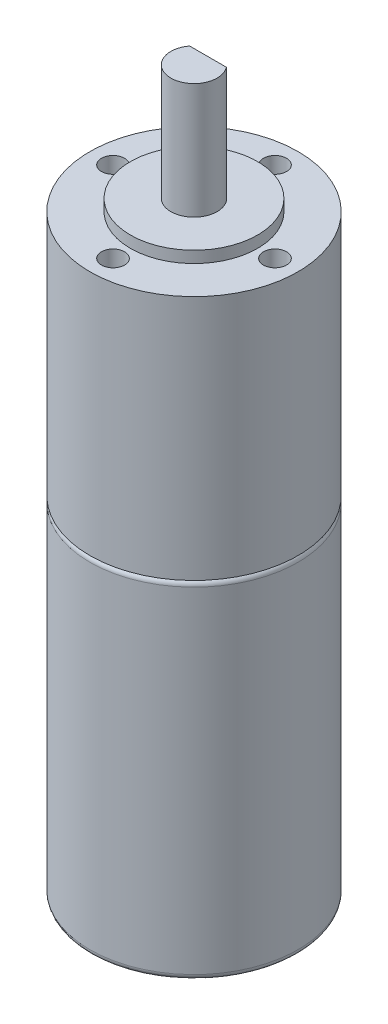
ISO-10303-21;
HEADER;
FILE_DESCRIPTION(('STEP AP214'),'2;1');
FILE_NAME('part.step','',(''),(''),'','','');
FILE_SCHEMA(('AUTOMOTIVE_DESIGN { 1 0 10303 214 1 1 1 1 }'));
ENDSEC;
DATA;
#1=APPLICATION_CONTEXT('core data for automotive mechanical design processes');
#2=APPLICATION_PROTOCOL_DEFINITION('international standard','automotive_design',2000,#1);
#3=PRODUCT_CONTEXT('',#1,'mechanical');
#4=PRODUCT('Part','Part','',(#3));
#5=PRODUCT_RELATED_PRODUCT_CATEGORY('part','',(#4));
#6=PRODUCT_DEFINITION_FORMATION('','',#4);
#7=PRODUCT_DEFINITION_CONTEXT('part definition',#1,'design');
#8=PRODUCT_DEFINITION('design','',#6,#7);
#9=PRODUCT_DEFINITION_SHAPE('','',#8);
#10=(LENGTH_UNIT() NAMED_UNIT(*) SI_UNIT(.MILLI.,.METRE.));
#11=(NAMED_UNIT(*) PLANE_ANGLE_UNIT() SI_UNIT($,.RADIAN.));
#12=(NAMED_UNIT(*) SI_UNIT($,.STERADIAN.) SOLID_ANGLE_UNIT());
#13=UNCERTAINTY_MEASURE_WITH_UNIT(LENGTH_MEASURE(1.E-05),#10,'distance_accuracy_value','');
#14=(GEOMETRIC_REPRESENTATION_CONTEXT(3) GLOBAL_UNCERTAINTY_ASSIGNED_CONTEXT((#13)) GLOBAL_UNIT_ASSIGNED_CONTEXT((#10,
#11,#12)) REPRESENTATION_CONTEXT('',''));
#15=CARTESIAN_POINT('',(0.,0.,0.));
#16=DIRECTION('',(0.,0.,1.));
#17=DIRECTION('',(1.,0.,0.));
#18=AXIS2_PLACEMENT_3D('',#15,#16,#17);
#19=CARTESIAN_POINT('',(0.,60.,0.));
#20=DIRECTION('',(0.,-1.,0.));
#21=DIRECTION('',(0.,0.,-1.));
#22=AXIS2_PLACEMENT_3D('',#19,#20,#21);
#23=CYLINDRICAL_SURFACE('',#22,18.);
#24=CARTESIAN_POINT('',(0.,1.,0.));
#25=DIRECTION('',(0.,1.,0.));
#26=DIRECTION('',(0.,0.,1.));
#27=AXIS2_PLACEMENT_3D('',#24,#25,#26);
#28=CIRCLE('',#27,18.);
#29=CARTESIAN_POINT('',(0.,1.,18.));
#30=VERTEX_POINT('',#29);
#31=EDGE_CURVE('E98',#30,#30,#28,.T.);
#32=ORIENTED_EDGE('',*,*,#31,.T.);
#33=EDGE_LOOP('',(#32));
#34=FACE_BOUND('',#33,.T.);
#35=CARTESIAN_POINT('',(0.,59.,0.));
#36=DIRECTION('',(0.,1.,0.));
#37=DIRECTION('',(0.,0.,1.));
#38=AXIS2_PLACEMENT_3D('',#35,#36,#37);
#39=CIRCLE('',#38,18.);
#40=CARTESIAN_POINT('',(0.,59.,18.));
#41=VERTEX_POINT('',#40);
#42=EDGE_CURVE('E93',#41,#41,#39,.F.);
#43=ORIENTED_EDGE('',*,*,#42,.T.);
#44=EDGE_LOOP('',(#43));
#45=FACE_BOUND('',#44,.T.);
#46=ADVANCED_FACE('F38',(#34,#45),#23,.T.);
#47=CARTESIAN_POINT('',(0.,0.,0.));
#48=DIRECTION('',(0.,1.,0.));
#49=DIRECTION('',(0.,0.,1.));
#50=AXIS2_PLACEMENT_3D('',#47,#48,#49);
#51=PLANE('',#50);
#52=CARTESIAN_POINT('',(0.,0.,0.));
#53=DIRECTION('',(0.,1.,0.));
#54=DIRECTION('',(0.,0.,1.));
#55=AXIS2_PLACEMENT_3D('',#52,#53,#54);
#56=CIRCLE('',#55,17.);
#57=CARTESIAN_POINT('',(0.,0.,17.));
#58=VERTEX_POINT('',#57);
#59=EDGE_CURVE('E100',#58,#58,#56,.F.);
#60=ORIENTED_EDGE('',*,*,#59,.T.);
#61=EDGE_LOOP('',(#60));
#62=FACE_BOUND('',#61,.T.);
#63=ADVANCED_FACE('F121',(#62),#51,.F.);
#64=CARTESIAN_POINT('',(0.,1.,0.));
#65=DIRECTION('',(0.,1.,0.));
#66=DIRECTION('',(0.,0.,1.));
#67=AXIS2_PLACEMENT_3D('',#64,#65,#66);
#68=TOROIDAL_SURFACE('',#67,17.,1.);
#69=ORIENTED_EDGE('',*,*,#59,.F.);
#70=EDGE_LOOP('',(#69));
#71=FACE_BOUND('',#70,.T.);
#72=ORIENTED_EDGE('',*,*,#31,.F.);
#73=EDGE_LOOP('',(#72));
#74=FACE_BOUND('',#73,.T.);
#75=ADVANCED_FACE('F112',(#71,#74),#68,.T.);
#76=CARTESIAN_POINT('',(0.,59.,0.));
#77=DIRECTION('',(0.,1.,0.));
#78=DIRECTION('',(0.,0.,1.));
#79=AXIS2_PLACEMENT_3D('',#76,#77,#78);
#80=TOROIDAL_SURFACE('',#79,17.,1.);
#81=ORIENTED_EDGE('',*,*,#42,.F.);
#82=EDGE_LOOP('',(#81));
#83=FACE_BOUND('',#82,.T.);
#84=CARTESIAN_POINT('',(0.,60.,0.));
#85=DIRECTION('',(0.,1.,0.));
#86=DIRECTION('',(0.,0.,1.));
#87=AXIS2_PLACEMENT_3D('',#84,#85,#86);
#88=CIRCLE('',#87,17.);
#89=CARTESIAN_POINT('',(0.,60.,17.));
#90=VERTEX_POINT('',#89);
#91=EDGE_CURVE('E42',#90,#90,#88,.T.);
#92=ORIENTED_EDGE('',*,*,#91,.F.);
#93=EDGE_LOOP('',(#92));
#94=FACE_BOUND('',#93,.T.);
#95=ADVANCED_FACE('F40',(#83,#94),#80,.T.);
#96=CARTESIAN_POINT('',(0.,102.5,0.));
#97=DIRECTION('',(0.,-1.,0.));
#98=DIRECTION('',(0.,0.,-1.));
#99=AXIS2_PLACEMENT_3D('',#96,#97,#98);
#100=CYLINDRICAL_SURFACE('',#99,18.);
#101=CARTESIAN_POINT('',(0.,102.5,0.));
#102=DIRECTION('',(0.,1.,0.));
#103=DIRECTION('',(0.,0.,1.));
#104=AXIS2_PLACEMENT_3D('',#101,#102,#103);
#105=CIRCLE('',#104,18.);
#106=CARTESIAN_POINT('',(0.,102.5,18.));
#107=VERTEX_POINT('',#106);
#108=EDGE_CURVE('E90',#107,#107,#105,.T.);
#109=ORIENTED_EDGE('',*,*,#108,.F.);
#110=EDGE_LOOP('',(#109));
#111=FACE_BOUND('',#110,.T.);
#112=CARTESIAN_POINT('',(0.,60.,0.));
#113=DIRECTION('',(0.,1.,0.));
#114=DIRECTION('',(0.,0.,1.));
#115=AXIS2_PLACEMENT_3D('',#112,#113,#114);
#116=CIRCLE('',#115,18.);
#117=CARTESIAN_POINT('',(0.,60.,18.));
#118=VERTEX_POINT('',#117);
#119=EDGE_CURVE('E84',#118,#118,#116,.T.);
#120=ORIENTED_EDGE('',*,*,#119,.T.);
#121=EDGE_LOOP('',(#120));
#122=FACE_BOUND('',#121,.T.);
#123=ADVANCED_FACE('F111',(#111,#122),#100,.T.);
#124=CARTESIAN_POINT('',(0.,102.5,0.));
#125=DIRECTION('',(0.,1.,0.));
#126=DIRECTION('',(0.,0.,1.));
#127=AXIS2_PLACEMENT_3D('',#124,#125,#126);
#128=PLANE('',#127);
#129=CARTESIAN_POINT('',(0.,102.5,-14.));
#130=DIRECTION('',(0.,1.,0.));
#131=DIRECTION('',(0.,0.,1.));
#132=AXIS2_PLACEMENT_3D('',#129,#130,#131);
#133=CIRCLE('',#132,2.);
#134=CARTESIAN_POINT('',(0.,102.5,-12.));
#135=VERTEX_POINT('',#134);
#136=EDGE_CURVE('E191',#135,#135,#133,.T.);
#137=ORIENTED_EDGE('',*,*,#136,.F.);
#138=EDGE_LOOP('',(#137));
#139=FACE_BOUND('',#138,.T.);
#140=CARTESIAN_POINT('',(14.0000000000004,102.5,-3.9618942650685E-13));
#141=DIRECTION('',(0.,1.,0.));
#142=DIRECTION('',(0.,0.,1.));
#143=AXIS2_PLACEMENT_3D('',#140,#141,#142);
#144=CIRCLE('',#143,2.00000000000031);
#145=CARTESIAN_POINT('',(14.0000000000004,102.5,1.99999999999991));
#146=VERTEX_POINT('',#145);
#147=EDGE_CURVE('E199',#146,#146,#144,.T.);
#148=ORIENTED_EDGE('',*,*,#147,.F.);
#149=EDGE_LOOP('',(#148));
#150=FACE_BOUND('',#149,.T.);
#151=CARTESIAN_POINT('',(7.923788530137E-13,102.5,14.));
#152=DIRECTION('',(0.,1.,0.));
#153=DIRECTION('',(0.,0.,1.));
#154=AXIS2_PLACEMENT_3D('',#151,#152,#153);
#155=CIRCLE('',#154,2.00000000000085);
#156=CARTESIAN_POINT('',(7.923788530137E-13,102.5,16.0000000000008));
#157=VERTEX_POINT('',#156);
#158=EDGE_CURVE('E205',#157,#157,#155,.T.);
#159=ORIENTED_EDGE('',*,*,#158,.F.);
#160=EDGE_LOOP('',(#159));
#161=FACE_BOUND('',#160,.T.);
#162=CARTESIAN_POINT('',(-13.9999999999996,102.5,3.97903932025656E-13));
#163=DIRECTION('',(0.,1.,0.));
#164=DIRECTION('',(0.,0.,1.));
#165=AXIS2_PLACEMENT_3D('',#162,#163,#164);
#166=CIRCLE('',#165,2.00000000000064);
#167=CARTESIAN_POINT('',(-13.9999999999996,102.5,2.00000000000104));
#168=VERTEX_POINT('',#167);
#169=EDGE_CURVE('E211',#168,#168,#166,.T.);
#170=ORIENTED_EDGE('',*,*,#169,.F.);
#171=EDGE_LOOP('',(#170));
#172=FACE_BOUND('',#171,.T.);
#173=CARTESIAN_POINT('',(0.,102.5,0.));
#174=DIRECTION('',(0.,1.,0.));
#175=DIRECTION('',(0.,0.,1.));
#176=AXIS2_PLACEMENT_3D('',#173,#174,#175);
#177=CIRCLE('',#176,11.);
#178=CARTESIAN_POINT('',(0.,102.5,11.));
#179=VERTEX_POINT('',#178);
#180=EDGE_CURVE('E47',#179,#179,#177,.T.);
#181=ORIENTED_EDGE('',*,*,#180,.F.);
#182=EDGE_LOOP('',(#181));
#183=FACE_BOUND('',#182,.T.);
#184=ORIENTED_EDGE('',*,*,#108,.T.);
#185=EDGE_LOOP('',(#184));
#186=FACE_BOUND('',#185,.T.);
#187=ADVANCED_FACE('F118',(#139,#150,#161,#172,#183,#186),#128,.T.);
#188=CARTESIAN_POINT('',(0.,60.,0.));
#189=DIRECTION('',(0.,1.,0.));
#190=DIRECTION('',(0.,0.,1.));
#191=AXIS2_PLACEMENT_3D('',#188,#189,#190);
#192=PLANE('',#191);
#193=ORIENTED_EDGE('',*,*,#91,.T.);
#194=EDGE_LOOP('',(#193));
#195=FACE_BOUND('',#194,.T.);
#196=ORIENTED_EDGE('',*,*,#119,.F.);
#197=EDGE_LOOP('',(#196));
#198=FACE_BOUND('',#197,.T.);
#199=ADVANCED_FACE('F107',(#195,#198),#192,.F.);
#200=CARTESIAN_POINT('',(0.,104.5,0.));
#201=DIRECTION('',(0.,-1.,0.));
#202=DIRECTION('',(0.,0.,-1.));
#203=AXIS2_PLACEMENT_3D('',#200,#201,#202);
#204=CYLINDRICAL_SURFACE('',#203,11.);
#205=CARTESIAN_POINT('',(0.,104.5,0.));
#206=DIRECTION('',(0.,1.,0.));
#207=DIRECTION('',(0.,0.,1.));
#208=AXIS2_PLACEMENT_3D('',#205,#206,#207);
#209=CIRCLE('',#208,11.);
#210=CARTESIAN_POINT('',(0.,104.5,11.));
#211=VERTEX_POINT('',#210);
#212=EDGE_CURVE('E81',#211,#211,#209,.T.);
#213=ORIENTED_EDGE('',*,*,#212,.F.);
#214=EDGE_LOOP('',(#213));
#215=FACE_BOUND('',#214,.T.);
#216=ORIENTED_EDGE('',*,*,#180,.T.);
#217=EDGE_LOOP('',(#216));
#218=FACE_BOUND('',#217,.T.);
#219=ADVANCED_FACE('F135',(#215,#218),#204,.T.);
#220=CARTESIAN_POINT('',(0.,104.5,0.));
#221=DIRECTION('',(0.,1.,0.));
#222=DIRECTION('',(0.,0.,1.));
#223=AXIS2_PLACEMENT_3D('',#220,#221,#222);
#224=PLANE('',#223);
#225=CARTESIAN_POINT('',(0.,104.5,0.));
#226=DIRECTION('',(0.,1.,0.));
#227=DIRECTION('',(0.,0.,1.));
#228=AXIS2_PLACEMENT_3D('',#225,#226,#227);
#229=CIRCLE('',#228,4.);
#230=CARTESIAN_POINT('',(0.,104.5,4.));
#231=VERTEX_POINT('',#230);
#232=EDGE_CURVE('E11',#231,#231,#229,.T.);
#233=ORIENTED_EDGE('',*,*,#232,.F.);
#234=EDGE_LOOP('',(#233));
#235=FACE_BOUND('',#234,.T.);
#236=ORIENTED_EDGE('',*,*,#212,.T.);
#237=EDGE_LOOP('',(#236));
#238=FACE_BOUND('',#237,.T.);
#239=ADVANCED_FACE('F141',(#235,#238),#224,.T.);
#240=CARTESIAN_POINT('',(0.,124.5,0.));
#241=DIRECTION('',(0.,-1.,0.));
#242=DIRECTION('',(0.,0.,-1.));
#243=AXIS2_PLACEMENT_3D('',#240,#241,#242);
#244=CYLINDRICAL_SURFACE('',#243,4.);
#245=CARTESIAN_POINT('',(0.,124.5,0.));
#246=DIRECTION('',(0.,1.,0.));
#247=DIRECTION('',(0.,0.,1.));
#248=AXIS2_PLACEMENT_3D('',#245,#246,#247);
#249=CIRCLE('',#248,4.);
#250=CARTESIAN_POINT('',(-3.18006864056845,124.5,-2.42634775769533));
#251=VERTEX_POINT('',#250);
#252=CARTESIAN_POINT('',(3.18006864056845,124.5,-2.42634775769533));
#253=VERTEX_POINT('',#252);
#254=EDGE_CURVE('E78',#251,#253,#249,.T.);
#255=ORIENTED_EDGE('',*,*,#254,.F.);
#256=DIRECTION('',(0.,1.,0.));
#257=VECTOR('',#256,1.);
#258=CARTESIAN_POINT('',(-3.18006864056845,109.5,-2.42634775769533));
#259=LINE('',#258,#257);
#260=CARTESIAN_POINT('',(-3.18006864056845,109.5,-2.42634775769533));
#261=VERTEX_POINT('',#260);
#262=EDGE_CURVE('E55',#261,#251,#259,.T.);
#263=ORIENTED_EDGE('',*,*,#262,.F.);
#264=CARTESIAN_POINT('',(0.,109.5,0.));
#265=DIRECTION('',(0.,1.,0.));
#266=DIRECTION('',(0.,0.,1.));
#267=AXIS2_PLACEMENT_3D('',#264,#265,#266);
#268=CIRCLE('',#267,4.);
#269=CARTESIAN_POINT('',(3.18006864056845,109.5,-2.42634775769533));
#270=VERTEX_POINT('',#269);
#271=EDGE_CURVE('E71',#270,#261,#268,.T.);
#272=ORIENTED_EDGE('',*,*,#271,.F.);
#273=DIRECTION('',(0.,1.,0.));
#274=VECTOR('',#273,1.);
#275=CARTESIAN_POINT('',(3.18006864056845,109.5,-2.42634775769533));
#276=LINE('',#275,#274);
#277=EDGE_CURVE('E61',#270,#253,#276,.T.);
#278=ORIENTED_EDGE('',*,*,#277,.T.);
#279=EDGE_LOOP('',(#255,#263,#272,#278));
#280=FACE_BOUND('',#279,.T.);
#281=ORIENTED_EDGE('',*,*,#232,.T.);
#282=EDGE_LOOP('',(#281));
#283=FACE_BOUND('',#282,.T.);
#284=ADVANCED_FACE('F76',(#280,#283),#244,.T.);
#285=CARTESIAN_POINT('',(0.,124.5,0.));
#286=DIRECTION('',(0.,1.,0.));
#287=DIRECTION('',(0.,0.,1.));
#288=AXIS2_PLACEMENT_3D('',#285,#286,#287);
#289=PLANE('',#288);
#290=DIRECTION('',(1.,0.,0.));
#291=VECTOR('',#290,1.);
#292=CARTESIAN_POINT('',(-3.18006864056845,124.5,-2.42634775769533));
#293=LINE('',#292,#291);
#294=EDGE_CURVE('E66',#251,#253,#293,.T.);
#295=ORIENTED_EDGE('',*,*,#294,.F.);
#296=ORIENTED_EDGE('',*,*,#254,.T.);
#297=EDGE_LOOP('',(#295,#296));
#298=FACE_BOUND('',#297,.T.);
#299=ADVANCED_FACE('F80',(#298),#289,.T.);
#300=CARTESIAN_POINT('',(-3.18006864056845,109.5,-2.42634775769533));
#301=DIRECTION('',(0.,0.,1.));
#302=DIRECTION('',(1.,0.,0.));
#303=AXIS2_PLACEMENT_3D('',#300,#301,#302);
#304=PLANE('',#303);
#305=ORIENTED_EDGE('',*,*,#294,.T.);
#306=ORIENTED_EDGE('',*,*,#277,.F.);
#307=DIRECTION('',(1.,0.,0.));
#308=VECTOR('',#307,1.);
#309=CARTESIAN_POINT('',(-3.18006864056845,109.5,-2.42634775769533));
#310=LINE('',#309,#308);
#311=EDGE_CURVE('E215',#261,#270,#310,.T.);
#312=ORIENTED_EDGE('',*,*,#311,.F.);
#313=ORIENTED_EDGE('',*,*,#262,.T.);
#314=EDGE_LOOP('',(#305,#306,#312,#313));
#315=FACE_BOUND('',#314,.T.);
#316=ADVANCED_FACE('F67',(#315),#304,.F.);
#317=CARTESIAN_POINT('',(0.,109.5,0.));
#318=DIRECTION('',(0.,1.,0.));
#319=DIRECTION('',(0.,0.,1.));
#320=AXIS2_PLACEMENT_3D('',#317,#318,#319);
#321=PLANE('',#320);
#322=ORIENTED_EDGE('',*,*,#271,.T.);
#323=ORIENTED_EDGE('',*,*,#311,.T.);
#324=EDGE_LOOP('',(#322,#323));
#325=FACE_BOUND('',#324,.T.);
#326=ADVANCED_FACE('F152',(#325),#321,.T.);
#327=CARTESIAN_POINT('',(-13.9999999999996,97.5,3.97903932025656E-13));
#328=DIRECTION('',(0.,1.,0.));
#329=DIRECTION('',(0.,0.,1.));
#330=AXIS2_PLACEMENT_3D('',#327,#328,#329);
#331=CYLINDRICAL_SURFACE('',#330,2.00000000000064);
#332=CARTESIAN_POINT('',(-13.9999999999996,97.5,3.97903932025656E-13));
#333=DIRECTION('',(0.,1.,0.));
#334=DIRECTION('',(0.,0.,1.));
#335=AXIS2_PLACEMENT_3D('',#332,#333,#334);
#336=CIRCLE('',#335,2.00000000000064);
#337=CARTESIAN_POINT('',(-13.9999999999996,97.5,2.00000000000104));
#338=VERTEX_POINT('',#337);
#339=EDGE_CURVE('E208',#338,#338,#336,.T.);
#340=ORIENTED_EDGE('',*,*,#339,.F.);
#341=EDGE_LOOP('',(#340));
#342=FACE_BOUND('',#341,.T.);
#343=ORIENTED_EDGE('',*,*,#169,.T.);
#344=EDGE_LOOP('',(#343));
#345=FACE_BOUND('',#344,.T.);
#346=ADVANCED_FACE('F155',(#342,#345),#331,.F.);
#347=CARTESIAN_POINT('',(-13.9999999999996,97.5,3.97903932025656E-13));
#348=DIRECTION('',(0.,1.,0.));
#349=DIRECTION('',(0.,0.,1.));
#350=AXIS2_PLACEMENT_3D('',#347,#348,#349);
#351=PLANE('',#350);
#352=ORIENTED_EDGE('',*,*,#339,.T.);
#353=EDGE_LOOP('',(#352));
#354=FACE_BOUND('',#353,.T.);
#355=ADVANCED_FACE('F159',(#354),#351,.T.);
#356=CARTESIAN_POINT('',(7.923788530137E-13,97.5,14.));
#357=DIRECTION('',(0.,1.,0.));
#358=DIRECTION('',(0.,0.,1.));
#359=AXIS2_PLACEMENT_3D('',#356,#357,#358);
#360=CYLINDRICAL_SURFACE('',#359,2.00000000000085);
#361=CARTESIAN_POINT('',(7.923788530137E-13,97.5,14.));
#362=DIRECTION('',(0.,1.,0.));
#363=DIRECTION('',(0.,0.,1.));
#364=AXIS2_PLACEMENT_3D('',#361,#362,#363);
#365=CIRCLE('',#364,2.00000000000085);
#366=CARTESIAN_POINT('',(7.923788530137E-13,97.5,16.0000000000008));
#367=VERTEX_POINT('',#366);
#368=EDGE_CURVE('E202',#367,#367,#365,.T.);
#369=ORIENTED_EDGE('',*,*,#368,.F.);
#370=EDGE_LOOP('',(#369));
#371=FACE_BOUND('',#370,.T.);
#372=ORIENTED_EDGE('',*,*,#158,.T.);
#373=EDGE_LOOP('',(#372));
#374=FACE_BOUND('',#373,.T.);
#375=ADVANCED_FACE('F163',(#371,#374),#360,.F.);
#376=CARTESIAN_POINT('',(7.923788530137E-13,97.5,14.));
#377=DIRECTION('',(0.,1.,0.));
#378=DIRECTION('',(0.,0.,1.));
#379=AXIS2_PLACEMENT_3D('',#376,#377,#378);
#380=PLANE('',#379);
#381=ORIENTED_EDGE('',*,*,#368,.T.);
#382=EDGE_LOOP('',(#381));
#383=FACE_BOUND('',#382,.T.);
#384=ADVANCED_FACE('F167',(#383),#380,.T.);
#385=CARTESIAN_POINT('',(14.0000000000004,97.5,-3.9618942650685E-13));
#386=DIRECTION('',(0.,1.,0.));
#387=DIRECTION('',(0.,0.,1.));
#388=AXIS2_PLACEMENT_3D('',#385,#386,#387);
#389=CYLINDRICAL_SURFACE('',#388,2.00000000000031);
#390=CARTESIAN_POINT('',(14.0000000000004,97.5,-3.9618942650685E-13));
#391=DIRECTION('',(0.,1.,0.));
#392=DIRECTION('',(0.,0.,1.));
#393=AXIS2_PLACEMENT_3D('',#390,#391,#392);
#394=CIRCLE('',#393,2.00000000000031);
#395=CARTESIAN_POINT('',(14.0000000000004,97.5,1.99999999999991));
#396=VERTEX_POINT('',#395);
#397=EDGE_CURVE('E194',#396,#396,#394,.T.);
#398=ORIENTED_EDGE('',*,*,#397,.F.);
#399=EDGE_LOOP('',(#398));
#400=FACE_BOUND('',#399,.T.);
#401=ORIENTED_EDGE('',*,*,#147,.T.);
#402=EDGE_LOOP('',(#401));
#403=FACE_BOUND('',#402,.T.);
#404=ADVANCED_FACE('F171',(#400,#403),#389,.F.);
#405=CARTESIAN_POINT('',(14.0000000000004,97.5,-3.9618942650685E-13));
#406=DIRECTION('',(0.,1.,0.));
#407=DIRECTION('',(0.,0.,1.));
#408=AXIS2_PLACEMENT_3D('',#405,#406,#407);
#409=PLANE('',#408);
#410=ORIENTED_EDGE('',*,*,#397,.T.);
#411=EDGE_LOOP('',(#410));
#412=FACE_BOUND('',#411,.T.);
#413=ADVANCED_FACE('F175',(#412),#409,.T.);
#414=CARTESIAN_POINT('',(0.,97.5,-14.));
#415=DIRECTION('',(0.,1.,0.));
#416=DIRECTION('',(0.,0.,1.));
#417=AXIS2_PLACEMENT_3D('',#414,#415,#416);
#418=CYLINDRICAL_SURFACE('',#417,2.);
#419=CARTESIAN_POINT('',(0.,97.5,-14.));
#420=DIRECTION('',(0.,1.,0.));
#421=DIRECTION('',(0.,0.,1.));
#422=AXIS2_PLACEMENT_3D('',#419,#420,#421);
#423=CIRCLE('',#422,2.);
#424=CARTESIAN_POINT('',(0.,97.5,-12.));
#425=VERTEX_POINT('',#424);
#426=EDGE_CURVE('E72',#425,#425,#423,.T.);
#427=ORIENTED_EDGE('',*,*,#426,.F.);
#428=EDGE_LOOP('',(#427));
#429=FACE_BOUND('',#428,.T.);
#430=ORIENTED_EDGE('',*,*,#136,.T.);
#431=EDGE_LOOP('',(#430));
#432=FACE_BOUND('',#431,.T.);
#433=ADVANCED_FACE('F179',(#429,#432),#418,.F.);
#434=CARTESIAN_POINT('',(0.,97.5,-14.));
#435=DIRECTION('',(0.,1.,0.));
#436=DIRECTION('',(0.,0.,1.));
#437=AXIS2_PLACEMENT_3D('',#434,#435,#436);
#438=PLANE('',#437);
#439=ORIENTED_EDGE('',*,*,#426,.T.);
#440=EDGE_LOOP('',(#439));
#441=FACE_BOUND('',#440,.T.);
#442=ADVANCED_FACE('F183',(#441),#438,.T.);
#443=CLOSED_SHELL('',(#46,#63,#75,#95,#123,#187,#199,#219,#239,#284,#299,#316,#326,#346,#355,
#375,#384,#404,#413,#433,#442));
#444=MANIFOLD_SOLID_BREP('B2',#443);
#445=ADVANCED_BREP_SHAPE_REPRESENTATION('',(#18,#444),#14);
#446=SHAPE_DEFINITION_REPRESENTATION(#9,#445);
ENDSEC;
END-ISO-10303-21;
